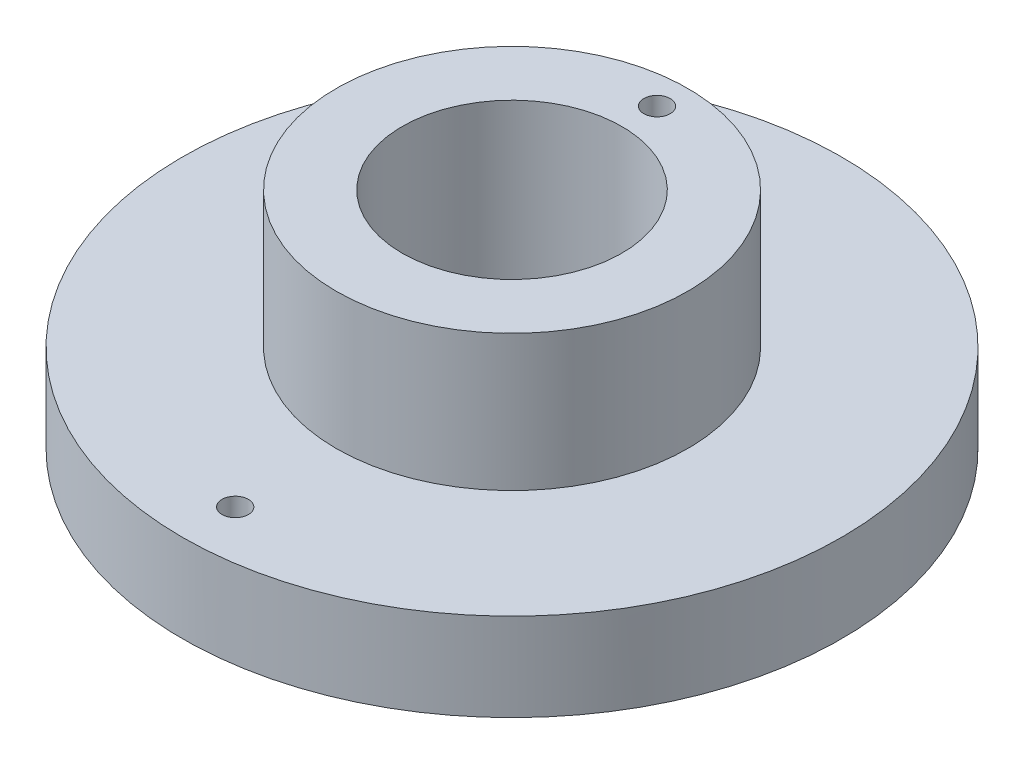
ISO-10303-21;
HEADER;
FILE_DESCRIPTION(('STEP AP214'),'2;1');
FILE_NAME('part.step','',(''),(''),'','','');
FILE_SCHEMA(('AUTOMOTIVE_DESIGN { 1 0 10303 214 1 1 1 1 }'));
ENDSEC;
DATA;
#1=APPLICATION_CONTEXT('core data for automotive mechanical design processes');
#2=APPLICATION_PROTOCOL_DEFINITION('international standard','automotive_design',2000,#1);
#3=PRODUCT_CONTEXT('',#1,'mechanical');
#4=PRODUCT('Part','Part','',(#3));
#5=PRODUCT_RELATED_PRODUCT_CATEGORY('part','',(#4));
#6=PRODUCT_DEFINITION_FORMATION('','',#4);
#7=PRODUCT_DEFINITION_CONTEXT('part definition',#1,'design');
#8=PRODUCT_DEFINITION('design','',#6,#7);
#9=PRODUCT_DEFINITION_SHAPE('','',#8);
#10=(LENGTH_UNIT() NAMED_UNIT(*) SI_UNIT(.MILLI.,.METRE.));
#11=(NAMED_UNIT(*) PLANE_ANGLE_UNIT() SI_UNIT($,.RADIAN.));
#12=(NAMED_UNIT(*) SI_UNIT($,.STERADIAN.) SOLID_ANGLE_UNIT());
#13=UNCERTAINTY_MEASURE_WITH_UNIT(LENGTH_MEASURE(1.E-05),#10,'distance_accuracy_value','');
#14=(GEOMETRIC_REPRESENTATION_CONTEXT(3) GLOBAL_UNCERTAINTY_ASSIGNED_CONTEXT((#13)) GLOBAL_UNIT_ASSIGNED_CONTEXT((#10,
#11,#12)) REPRESENTATION_CONTEXT('',''));
#15=CARTESIAN_POINT('',(0.,0.,0.));
#16=DIRECTION('',(0.,0.,1.));
#17=DIRECTION('',(1.,0.,0.));
#18=AXIS2_PLACEMENT_3D('',#15,#16,#17);
#19=CARTESIAN_POINT('',(0.,9.5,-28.5));
#20=DIRECTION('',(0.,-1.,0.));
#21=DIRECTION('',(0.,0.,-1.));
#22=AXIS2_PLACEMENT_3D('',#19,#20,#21);
#23=CYLINDRICAL_SURFACE('',#22,1.5);
#24=CARTESIAN_POINT('',(0.,4.,-28.5));
#25=DIRECTION('',(0.,-1.,0.));
#26=DIRECTION('',(0.,0.,-1.));
#27=AXIS2_PLACEMENT_3D('',#24,#25,#26);
#28=CIRCLE('',#27,1.5);
#29=CARTESIAN_POINT('',(0.,4.,-30.));
#30=VERTEX_POINT('',#29);
#31=EDGE_CURVE('E121',#30,#30,#28,.T.);
#32=ORIENTED_EDGE('',*,*,#31,.T.);
#33=EDGE_LOOP('',(#32));
#34=FACE_BOUND('',#33,.T.);
#35=CARTESIAN_POINT('',(0.,8.,-28.5));
#36=DIRECTION('',(0.,-0.707106781186547,-0.707106781186547));
#37=DIRECTION('',(0.,-0.707106781186547,0.707106781186547));
#38=AXIS2_PLACEMENT_3D('',#35,#36,#37);
#39=ELLIPSE('',#38,2.12132034355964,1.5);
#40=CARTESIAN_POINT('',(-1.5,8.,-28.5));
#41=VERTEX_POINT('',#40);
#42=CARTESIAN_POINT('',(1.5,8.,-28.5));
#43=VERTEX_POINT('',#42);
#44=EDGE_CURVE('E62',#41,#43,#39,.F.);
#45=ORIENTED_EDGE('',*,*,#44,.T.);
#46=CARTESIAN_POINT('',(0.,8.,-28.5));
#47=DIRECTION('',(0.,-0.707106781186547,0.707106781186547));
#48=DIRECTION('',(0.,-0.707106781186547,-0.707106781186547));
#49=AXIS2_PLACEMENT_3D('',#46,#47,#48);
#50=ELLIPSE('',#49,2.12132034355964,1.5);
#51=CARTESIAN_POINT('',(0.,6.5,-30.));
#52=VERTEX_POINT('',#51);
#53=EDGE_CURVE('E194',#43,#52,#50,.F.);
#54=ORIENTED_EDGE('',*,*,#53,.T.);
#55=EDGE_CURVE('E189',#52,#41,#50,.F.);
#56=ORIENTED_EDGE('',*,*,#55,.T.);
#57=EDGE_LOOP('',(#45,#54,#56));
#58=FACE_BOUND('',#57,.T.);
#59=ADVANCED_FACE('F41',(#34,#58),#23,.F.);
#60=CARTESIAN_POINT('',(0.,8.,0.));
#61=DIRECTION('',(0.,-1.,0.));
#62=DIRECTION('',(0.,0.,-1.));
#63=AXIS2_PLACEMENT_3D('',#60,#61,#62);
#64=CYLINDRICAL_SURFACE('',#63,20.);
#65=CARTESIAN_POINT('',(0.,0.,0.));
#66=DIRECTION('',(0.,1.,0.));
#67=DIRECTION('',(0.,0.,1.));
#68=AXIS2_PLACEMENT_3D('',#65,#66,#67);
#69=CIRCLE('',#68,20.);
#70=CARTESIAN_POINT('',(-20.,0.,0.));
#71=VERTEX_POINT('',#70);
#72=CARTESIAN_POINT('',(20.,0.,0.));
#73=VERTEX_POINT('',#72);
#74=EDGE_CURVE('E242',#71,#73,#69,.T.);
#75=ORIENTED_EDGE('',*,*,#74,.T.);
#76=DIRECTION('',(0.,-1.,0.));
#77=VECTOR('',#76,1.);
#78=CARTESIAN_POINT('',(20.,8.,0.));
#79=LINE('',#78,#77);
#80=CARTESIAN_POINT('',(20.,8.,0.));
#81=VERTEX_POINT('',#80);
#82=EDGE_CURVE('E229',#81,#73,#79,.T.);
#83=ORIENTED_EDGE('',*,*,#82,.F.);
#84=CARTESIAN_POINT('',(0.,8.,0.));
#85=DIRECTION('',(0.,1.,0.));
#86=DIRECTION('',(0.,0.,1.));
#87=AXIS2_PLACEMENT_3D('',#84,#85,#86);
#88=CIRCLE('',#87,20.);
#89=CARTESIAN_POINT('',(-20.,8.,0.));
#90=VERTEX_POINT('',#89);
#91=EDGE_CURVE('E246',#90,#81,#88,.T.);
#92=ORIENTED_EDGE('',*,*,#91,.F.);
#93=DIRECTION('',(0.,-1.,0.));
#94=VECTOR('',#93,1.);
#95=CARTESIAN_POINT('',(-20.,8.,0.));
#96=LINE('',#95,#94);
#97=EDGE_CURVE('E259',#90,#71,#96,.T.);
#98=ORIENTED_EDGE('',*,*,#97,.T.);
#99=EDGE_LOOP('',(#75,#83,#92,#98));
#100=FACE_BOUND('',#99,.T.);
#101=ADVANCED_FACE('F168',(#100),#64,.T.);
#102=CARTESIAN_POINT('',(20.,8.,0.));
#103=DIRECTION('',(-1.,0.,0.));
#104=DIRECTION('',(0.,0.,1.));
#105=AXIS2_PLACEMENT_3D('',#102,#103,#104);
#106=PLANE('',#105);
#107=DIRECTION('',(0.,0.,-1.));
#108=VECTOR('',#107,1.);
#109=CARTESIAN_POINT('',(20.,0.,0.));
#110=LINE('',#109,#108);
#111=CARTESIAN_POINT('',(20.,0.,-31.7214438511238));
#112=VERTEX_POINT('',#111);
#113=EDGE_CURVE('E263',#73,#112,#110,.T.);
#114=ORIENTED_EDGE('',*,*,#113,.T.);
#115=DIRECTION('',(0.,-1.,0.));
#116=VECTOR('',#115,1.);
#117=CARTESIAN_POINT('',(20.,8.,-31.7214438511238));
#118=LINE('',#117,#116);
#119=CARTESIAN_POINT('',(20.,8.,-31.7214438511238));
#120=VERTEX_POINT('',#119);
#121=EDGE_CURVE('E278',#120,#112,#118,.T.);
#122=ORIENTED_EDGE('',*,*,#121,.F.);
#123=DIRECTION('',(0.,0.,-1.));
#124=VECTOR('',#123,1.);
#125=CARTESIAN_POINT('',(20.,8.,0.));
#126=LINE('',#125,#124);
#127=EDGE_CURVE('E250',#81,#120,#126,.T.);
#128=ORIENTED_EDGE('',*,*,#127,.F.);
#129=ORIENTED_EDGE('',*,*,#82,.T.);
#130=EDGE_LOOP('',(#114,#122,#128,#129));
#131=FACE_BOUND('',#130,.T.);
#132=ADVANCED_FACE('F173',(#131),#106,.F.);
#133=CARTESIAN_POINT('',(0.,8.,0.));
#134=DIRECTION('',(0.,-1.,0.));
#135=DIRECTION('',(0.,0.,-1.));
#136=AXIS2_PLACEMENT_3D('',#133,#134,#135);
#137=CYLINDRICAL_SURFACE('',#136,37.5);
#138=CARTESIAN_POINT('',(0.,0.,0.));
#139=DIRECTION('',(0.,1.,0.));
#140=DIRECTION('',(0.,0.,1.));
#141=AXIS2_PLACEMENT_3D('',#138,#139,#140);
#142=CIRCLE('',#141,37.5);
#143=CARTESIAN_POINT('',(-20.,0.,-31.7214438511238));
#144=VERTEX_POINT('',#143);
#145=EDGE_CURVE('E266',#112,#144,#142,.T.);
#146=ORIENTED_EDGE('',*,*,#145,.T.);
#147=DIRECTION('',(0.,-1.,0.));
#148=VECTOR('',#147,1.);
#149=CARTESIAN_POINT('',(-20.,8.,-31.7214438511238));
#150=LINE('',#149,#148);
#151=CARTESIAN_POINT('',(-20.,8.,-31.7214438511238));
#152=VERTEX_POINT('',#151);
#153=EDGE_CURVE('E274',#152,#144,#150,.T.);
#154=ORIENTED_EDGE('',*,*,#153,.F.);
#155=CARTESIAN_POINT('',(0.,8.,0.));
#156=DIRECTION('',(0.,1.,0.));
#157=DIRECTION('',(0.,0.,1.));
#158=AXIS2_PLACEMENT_3D('',#155,#156,#157);
#159=CIRCLE('',#158,37.5);
#160=EDGE_CURVE('E234',#152,#120,#159,.T.);
#161=ORIENTED_EDGE('',*,*,#160,.T.);
#162=ORIENTED_EDGE('',*,*,#121,.T.);
#163=EDGE_LOOP('',(#146,#154,#161,#162));
#164=FACE_BOUND('',#163,.T.);
#165=CARTESIAN_POINT('',(0.,18.,0.));
#166=DIRECTION('',(0.,1.,0.));
#167=DIRECTION('',(0.,0.,1.));
#168=AXIS2_PLACEMENT_3D('',#165,#166,#167);
#169=CIRCLE('',#168,37.5);
#170=CARTESIAN_POINT('',(0.,18.,37.5));
#171=VERTEX_POINT('',#170);
#172=EDGE_CURVE('E238',#171,#171,#169,.T.);
#173=ORIENTED_EDGE('',*,*,#172,.F.);
#174=EDGE_LOOP('',(#173));
#175=FACE_BOUND('',#174,.T.);
#176=ADVANCED_FACE('F298',(#164,#175),#137,.T.);
#177=CARTESIAN_POINT('',(-20.,8.,0.));
#178=DIRECTION('',(1.,0.,0.));
#179=DIRECTION('',(0.,0.,-1.));
#180=AXIS2_PLACEMENT_3D('',#177,#178,#179);
#181=PLANE('',#180);
#182=DIRECTION('',(0.,0.,1.));
#183=VECTOR('',#182,1.);
#184=CARTESIAN_POINT('',(-20.,0.,0.));
#185=LINE('',#184,#183);
#186=EDGE_CURVE('E251',#144,#71,#185,.T.);
#187=ORIENTED_EDGE('',*,*,#186,.T.);
#188=ORIENTED_EDGE('',*,*,#97,.F.);
#189=DIRECTION('',(0.,0.,1.));
#190=VECTOR('',#189,1.);
#191=CARTESIAN_POINT('',(-20.,8.,0.));
#192=LINE('',#191,#190);
#193=EDGE_CURVE('E255',#152,#90,#192,.T.);
#194=ORIENTED_EDGE('',*,*,#193,.F.);
#195=ORIENTED_EDGE('',*,*,#153,.T.);
#196=EDGE_LOOP('',(#187,#188,#194,#195));
#197=FACE_BOUND('',#196,.T.);
#198=ADVANCED_FACE('F302',(#197),#181,.F.);
#199=CARTESIAN_POINT('',(0.,0.,0.));
#200=DIRECTION('',(0.,1.,0.));
#201=DIRECTION('',(0.,0.,1.));
#202=AXIS2_PLACEMENT_3D('',#199,#200,#201);
#203=PLANE('',#202);
#204=CARTESIAN_POINT('',(0.,0.,-28.5));
#205=DIRECTION('',(0.,-1.,0.));
#206=DIRECTION('',(0.,0.,-1.));
#207=AXIS2_PLACEMENT_3D('',#204,#205,#206);
#208=CIRCLE('',#207,7.5);
#209=CARTESIAN_POINT('',(0.,0.,-36.));
#210=VERTEX_POINT('',#209);
#211=EDGE_CURVE('E205',#210,#210,#208,.T.);
#212=ORIENTED_EDGE('',*,*,#211,.F.);
#213=EDGE_LOOP('',(#212));
#214=FACE_BOUND('',#213,.T.);
#215=CARTESIAN_POINT('',(0.,0.,0.));
#216=DIRECTION('',(0.,1.,0.));
#217=DIRECTION('',(0.,0.,1.));
#218=AXIS2_PLACEMENT_3D('',#215,#216,#217);
#219=CIRCLE('',#218,12.5);
#220=CARTESIAN_POINT('',(0.,0.,12.5));
#221=VERTEX_POINT('',#220);
#222=EDGE_CURVE('E214',#221,#221,#219,.T.);
#223=ORIENTED_EDGE('',*,*,#222,.T.);
#224=EDGE_LOOP('',(#223));
#225=FACE_BOUND('',#224,.T.);
#226=ORIENTED_EDGE('',*,*,#74,.F.);
#227=ORIENTED_EDGE('',*,*,#186,.F.);
#228=ORIENTED_EDGE('',*,*,#145,.F.);
#229=ORIENTED_EDGE('',*,*,#113,.F.);
#230=EDGE_LOOP('',(#226,#227,#228,#229));
#231=FACE_BOUND('',#230,.T.);
#232=ADVANCED_FACE('F295',(#214,#225,#231),#203,.F.);
#233=CARTESIAN_POINT('',(0.,8.,0.));
#234=DIRECTION('',(0.,1.,0.));
#235=DIRECTION('',(0.,0.,1.));
#236=AXIS2_PLACEMENT_3D('',#233,#234,#235);
#237=PLANE('',#236);
#238=CARTESIAN_POINT('',(0.,8.,31.5));
#239=DIRECTION('',(0.,1.,0.));
#240=DIRECTION('',(0.,0.,1.));
#241=AXIS2_PLACEMENT_3D('',#238,#239,#240);
#242=CIRCLE('',#241,1.5);
#243=CARTESIAN_POINT('',(0.,8.,33.));
#244=VERTEX_POINT('',#243);
#245=EDGE_CURVE('E224',#244,#244,#242,.T.);
#246=ORIENTED_EDGE('',*,*,#245,.T.);
#247=EDGE_LOOP('',(#246));
#248=FACE_BOUND('',#247,.T.);
#249=ORIENTED_EDGE('',*,*,#91,.T.);
#250=ORIENTED_EDGE('',*,*,#127,.T.);
#251=ORIENTED_EDGE('',*,*,#160,.F.);
#252=ORIENTED_EDGE('',*,*,#193,.T.);
#253=EDGE_LOOP('',(#249,#250,#251,#252));
#254=FACE_BOUND('',#253,.T.);
#255=ADVANCED_FACE('F305',(#248,#254),#237,.F.);
#256=CARTESIAN_POINT('',(0.,18.,0.));
#257=DIRECTION('',(0.,1.,0.));
#258=DIRECTION('',(0.,0.,1.));
#259=AXIS2_PLACEMENT_3D('',#256,#257,#258);
#260=PLANE('',#259);
#261=CARTESIAN_POINT('',(0.,18.,0.));
#262=DIRECTION('',(0.,1.,0.));
#263=DIRECTION('',(0.,0.,1.));
#264=AXIS2_PLACEMENT_3D('',#261,#262,#263);
#265=CIRCLE('',#264,20.);
#266=CARTESIAN_POINT('',(0.,18.,20.));
#267=VERTEX_POINT('',#266);
#268=EDGE_CURVE('E225',#267,#267,#265,.T.);
#269=ORIENTED_EDGE('',*,*,#268,.F.);
#270=EDGE_LOOP('',(#269));
#271=FACE_BOUND('',#270,.T.);
#272=ORIENTED_EDGE('',*,*,#172,.T.);
#273=EDGE_LOOP('',(#272));
#274=FACE_BOUND('',#273,.T.);
#275=CARTESIAN_POINT('',(0.,18.,31.5));
#276=DIRECTION('',(0.,1.,0.));
#277=DIRECTION('',(0.,0.,1.));
#278=AXIS2_PLACEMENT_3D('',#275,#276,#277);
#279=CIRCLE('',#278,1.5);
#280=CARTESIAN_POINT('',(0.,18.,33.));
#281=VERTEX_POINT('',#280);
#282=EDGE_CURVE('E230',#281,#281,#279,.T.);
#283=ORIENTED_EDGE('',*,*,#282,.F.);
#284=EDGE_LOOP('',(#283));
#285=FACE_BOUND('',#284,.T.);
#286=ADVANCED_FACE('F307',(#271,#274,#285),#260,.T.);
#287=CARTESIAN_POINT('',(0.,18.,31.5));
#288=DIRECTION('',(0.,-1.,0.));
#289=DIRECTION('',(0.,0.,-1.));
#290=AXIS2_PLACEMENT_3D('',#287,#288,#289);
#291=CYLINDRICAL_SURFACE('',#290,1.5);
#292=ORIENTED_EDGE('',*,*,#282,.T.);
#293=EDGE_LOOP('',(#292));
#294=FACE_BOUND('',#293,.T.);
#295=ORIENTED_EDGE('',*,*,#245,.F.);
#296=EDGE_LOOP('',(#295));
#297=FACE_BOUND('',#296,.T.);
#298=ADVANCED_FACE('F314',(#294,#297),#291,.F.);
#299=CARTESIAN_POINT('',(0.,33.5,0.));
#300=DIRECTION('',(0.,-1.,0.));
#301=DIRECTION('',(0.,0.,-1.));
#302=AXIS2_PLACEMENT_3D('',#299,#300,#301);
#303=CYLINDRICAL_SURFACE('',#302,20.);
#304=CARTESIAN_POINT('',(0.,33.5,0.));
#305=DIRECTION('',(0.,1.,0.));
#306=DIRECTION('',(0.,0.,1.));
#307=AXIS2_PLACEMENT_3D('',#304,#305,#306);
#308=CIRCLE('',#307,20.);
#309=CARTESIAN_POINT('',(0.,33.5,20.));
#310=VERTEX_POINT('',#309);
#311=EDGE_CURVE('E219',#310,#310,#308,.T.);
#312=ORIENTED_EDGE('',*,*,#311,.F.);
#313=EDGE_LOOP('',(#312));
#314=FACE_BOUND('',#313,.T.);
#315=ORIENTED_EDGE('',*,*,#268,.T.);
#316=EDGE_LOOP('',(#315));
#317=FACE_BOUND('',#316,.T.);
#318=ADVANCED_FACE('F348',(#314,#317),#303,.T.);
#319=CARTESIAN_POINT('',(0.,33.5,0.));
#320=DIRECTION('',(0.,1.,0.));
#321=DIRECTION('',(0.,0.,1.));
#322=AXIS2_PLACEMENT_3D('',#319,#320,#321);
#323=PLANE('',#322);
#324=CARTESIAN_POINT('',(0.,33.5,-16.5));
#325=DIRECTION('',(0.,1.,0.));
#326=DIRECTION('',(0.,0.,1.));
#327=AXIS2_PLACEMENT_3D('',#324,#325,#326);
#328=CIRCLE('',#327,1.5);
#329=CARTESIAN_POINT('',(0.,33.5,-15.));
#330=VERTEX_POINT('',#329);
#331=EDGE_CURVE('E433',#330,#330,#328,.T.);
#332=ORIENTED_EDGE('',*,*,#331,.F.);
#333=EDGE_LOOP('',(#332));
#334=FACE_BOUND('',#333,.T.);
#335=CARTESIAN_POINT('',(0.,33.5,0.));
#336=DIRECTION('',(0.,1.,0.));
#337=DIRECTION('',(0.,0.,1.));
#338=AXIS2_PLACEMENT_3D('',#335,#336,#337);
#339=CIRCLE('',#338,12.5);
#340=CARTESIAN_POINT('',(0.,33.5,12.5));
#341=VERTEX_POINT('',#340);
#342=EDGE_CURVE('E209',#341,#341,#339,.T.);
#343=ORIENTED_EDGE('',*,*,#342,.F.);
#344=EDGE_LOOP('',(#343));
#345=FACE_BOUND('',#344,.T.);
#346=ORIENTED_EDGE('',*,*,#311,.T.);
#347=EDGE_LOOP('',(#346));
#348=FACE_BOUND('',#347,.T.);
#349=ADVANCED_FACE('F164',(#334,#345,#348),#323,.T.);
#350=CARTESIAN_POINT('',(0.,0.,0.));
#351=DIRECTION('',(0.,1.,0.));
#352=DIRECTION('',(0.,0.,1.));
#353=AXIS2_PLACEMENT_3D('',#350,#351,#352);
#354=CYLINDRICAL_SURFACE('',#353,12.5);
#355=CARTESIAN_POINT('',(1.5,8.,-12.4096736459909));
#356=CARTESIAN_POINT('',(1.49999641586388,7.91607042940482,-12.4096748089167));
#357=CARTESIAN_POINT('',(1.49293206748169,7.8320877399393,-12.4105342894214));
#358=CARTESIAN_POINT('',(1.46486159354819,7.66645769398423,-12.4138782255216));
#359=CARTESIAN_POINT('',(1.44384072619508,7.58481290215949,-12.4163643992983));
#360=CARTESIAN_POINT('',(1.38848417307918,7.4262807972431,-12.4226761552619));
#361=CARTESIAN_POINT('',(1.35415731394874,7.3493903694319,-12.426500849368));
#362=CARTESIAN_POINT('',(1.27318168778971,7.20247642894952,-12.4350576249844));
#363=CARTESIAN_POINT('',(1.22653510106007,7.13245170421602,-12.4397895458966));
#364=CARTESIAN_POINT('',(1.1219857196502,7.00088011419492,-12.4496550027324));
#365=CARTESIAN_POINT('',(1.06403198625323,6.9393738528257,-12.4547902908254));
#366=CARTESIAN_POINT('',(0.938622932174395,6.82693564091905,-12.4648680792729));
#367=CARTESIAN_POINT('',(0.871167147527068,6.77600420702911,-12.4698105701984));
#368=CARTESIAN_POINT('',(0.728414784233988,6.68601673353187,-12.4789637011531));
#369=CARTESIAN_POINT('',(0.653094976924495,6.64699729213019,-12.4831720690333));
#370=CARTESIAN_POINT('',(0.496912883636389,6.58217576980764,-12.4903635621621));
#371=CARTESIAN_POINT('',(0.416050788042771,6.55637323512614,-12.4933467294733));
#372=CARTESIAN_POINT('',(0.251493928492541,6.51883887194828,-12.4977393662263));
#373=CARTESIAN_POINT('',(0.16781473552169,6.50703967327712,-12.4991563682204));
#374=CARTESIAN_POINT('',(-0.000347248334282176,6.49763820034475,-12.5002827183051));
#375=CARTESIAN_POINT('',(-0.0848300098341692,6.50003540892089,-12.4999921286017));
#376=CARTESIAN_POINT('',(-0.251742833758764,6.51890456092568,-12.4977421462633));
#377=CARTESIAN_POINT('',(-0.334181218784106,6.5353040524862,-12.4957913442169));
#378=CARTESIAN_POINT('',(-0.495127185045588,6.581599075858,-12.490449821119));
#379=CARTESIAN_POINT('',(-0.573634696521301,6.61149484709083,-12.4870590745233));
#380=CARTESIAN_POINT('',(-0.724715561629687,6.68401136445327,-12.4792038952277));
#381=CARTESIAN_POINT('',(-0.797273648637691,6.72666361800322,-12.4747368094346));
#382=CARTESIAN_POINT('',(-0.934229460099391,6.82345944947808,-12.465229048358));
#383=CARTESIAN_POINT('',(-0.998626839383445,6.87760351320781,-12.4601883488298));
#384=CARTESIAN_POINT('',(-1.11785860561525,6.99625217477023,-12.4500603372648));
#385=CARTESIAN_POINT('',(-1.17263019439189,7.06081989068675,-12.4449729316271));
#386=CARTESIAN_POINT('',(-1.27056795912578,7.19826575683976,-12.4353563023037));
#387=CARTESIAN_POINT('',(-1.31373410365263,7.27114392958224,-12.4308270801297));
#388=CARTESIAN_POINT('',(-1.38723839179325,7.42319624507369,-12.4228396027608));
#389=CARTESIAN_POINT('',(-1.41757175578821,7.50237272062896,-12.4193817467283));
#390=CARTESIAN_POINT('',(-1.46449505016189,7.66474617975059,-12.4139364153306));
#391=CARTESIAN_POINT('',(-1.48108558929275,7.74794298505965,-12.4119488748366));
#392=CARTESIAN_POINT('',(-1.49996964356083,7.91544154818834,-12.4096810007818));
#393=CARTESIAN_POINT('',(-1.50235142135386,7.99973321794057,-12.4093901280317));
#394=CARTESIAN_POINT('',(-1.49298299027801,8.16751439042147,-12.4105206650573));
#395=CARTESIAN_POINT('',(-1.48123305845624,8.25100390884369,-12.411942041265));
#396=CARTESIAN_POINT('',(-1.44400895971009,8.41454789179899,-12.4163273137489));
#397=CARTESIAN_POINT('',(-1.41857731249469,8.49461217340466,-12.4192864301079));
#398=CARTESIAN_POINT('',(-1.35475538396312,8.64933964148798,-12.4264098926624));
#399=CARTESIAN_POINT('',(-1.31636468129306,8.72400265225153,-12.4305742780457));
#400=CARTESIAN_POINT('',(-1.22749651360805,8.86620814748732,-12.4396643656649));
#401=CARTESIAN_POINT('',(-1.17696103570738,8.93371414344066,-12.4445936804928));
#402=CARTESIAN_POINT('',(-1.06532008918354,9.0593175565059,-12.4546467770184));
#403=CARTESIAN_POINT('',(-1.0042142422181,9.11741463670294,-12.4597705656719));
#404=CARTESIAN_POINT('',(-0.872782136333861,9.22285987361746,-12.4696675472455));
#405=CARTESIAN_POINT('',(-0.802409249708917,9.27015012325571,-12.4744387628015));
#406=CARTESIAN_POINT('',(-0.654668214705289,9.35223910466455,-12.483063621558));
#407=CARTESIAN_POINT('',(-0.577300197822208,9.38703807118723,-12.4869172820019));
#408=CARTESIAN_POINT('',(-0.417959622359993,9.4430605024379,-12.4932640215257));
#409=CARTESIAN_POINT('',(-0.335999085323591,9.46431775994213,-12.4957604851314));
#410=CARTESIAN_POINT('',(-0.169640292495739,9.49276337179108,-12.4991255682254));
#411=CARTESIAN_POINT('',(-0.085242137730631,9.49995230834657,-12.4999942550783));
#412=CARTESIAN_POINT('',(0.0830300031278291,9.50004692205617,-12.5000056524324));
#413=CARTESIAN_POINT('',(0.166903952329435,9.49304201834161,-12.4991591682624));
#414=CARTESIAN_POINT('',(0.332273612398116,9.46513677254877,-12.4958567701035));
#415=CARTESIAN_POINT('',(0.413769324044743,9.44423643502524,-12.4934008566421));
#416=CARTESIAN_POINT('',(0.572059777991806,9.38916099243421,-12.4871544009745));
#417=CARTESIAN_POINT('',(0.648855904373997,9.35498981777276,-12.4833642539575));
#418=CARTESIAN_POINT('',(0.795637705262654,9.2743519652078,-12.474869622158));
#419=CARTESIAN_POINT('',(0.865623324646849,9.22788518779857,-12.4701651299761));
#420=CARTESIAN_POINT('',(0.997254742124291,9.12364315899688,-12.4603319681132));
#421=CARTESIAN_POINT('',(1.0588476339384,9.06580132233712,-12.4552009088046));
#422=CARTESIAN_POINT('',(1.17148865356204,8.94058848142379,-12.4451123432295));
#423=CARTESIAN_POINT('',(1.22253427406543,8.87321521774935,-12.4401548784622));
#424=CARTESIAN_POINT('',(1.31278537364373,8.73057853191476,-12.4309559603764));
#425=CARTESIAN_POINT('',(1.35194799100155,8.65528783586353,-12.4267171228205));
#426=CARTESIAN_POINT('',(1.41701902911872,8.49919112312462,-12.419466118837));
#427=CARTESIAN_POINT('',(1.44294198213015,8.41839126440112,-12.4164526081981));
#428=CARTESIAN_POINT('',(1.4745350503682,8.28097023044731,-12.4127313618494));
#429=CARTESIAN_POINT('',(1.48407082470974,8.22521862402006,-12.4115903654975));
#430=CARTESIAN_POINT('',(1.49680448454755,8.11298603393288,-12.4100611186528));
#431=CARTESIAN_POINT('',(1.50000241299709,8.05650505521871,-12.4096728630583));
#432=CARTESIAN_POINT('',(1.5,8.,-12.4096736459909));
#433=B_SPLINE_CURVE_WITH_KNOTS('',3,(#355,#356,#357,#358,#359,#360,#361,#362,#363,#364,#365,
#366,#367,#368,#369,#370,#371,#372,#373,#374,#375,#376,#377,#378,#379,#380,#381,#382,#383,#384,
#385,#386,#387,#388,#389,#390,#391,#392,#393,#394,#395,#396,#397,#398,#399,#400,#401,#402,#403,
#404,#405,#406,#407,#408,#409,#410,#411,#412,#413,#414,#415,#416,#417,#418,#419,#420,#421,#422,
#423,#424,#425,#426,#427,#428,#429,#430,#431,#432),.UNSPECIFIED.,.T.,.F.,(4,2,2,2,2,2,2,2,2,2,2,
2,2,2,2,2,2,2,2,2,2,2,2,2,2,2,2,2,2,2,2,2,2,2,2,2,2,2,4),(0.,0.25158230660961,0.503430774819311,
0.755112462522262,1.0067496383611,1.25954776660377,1.51235824273611,1.7659378087677,
2.01950866836447,2.27185458608052,2.52419131111312,2.77523023079344,3.02627360403335,
3.27794222677635,3.52962149067918,3.78288622204422,4.03615163930559,4.28951130338294,
4.54285974404081,4.79463277043148,5.0464008609825,5.29739099483104,5.54838929022027,
5.80061125155309,6.05284224246468,6.30639464647639,6.55994228515919,6.81285470170487,
7.06575665136928,7.31707030939076,7.56838388503437,7.81962308616498,8.07086432058376,
8.32362252061905,8.57644073759112,8.83016031080822,9.08360079205962,9.25297814464872,
9.42235434931908),.UNSPECIFIED.);
#434=CARTESIAN_POINT('',(1.5,8.,-12.4096736459909));
#435=VERTEX_POINT('',#434);
#436=EDGE_CURVE('E118',#435,#435,#433,.T.);
#437=ORIENTED_EDGE('',*,*,#436,.T.);
#438=EDGE_LOOP('',(#437));
#439=FACE_BOUND('',#438,.T.);
#440=ORIENTED_EDGE('',*,*,#222,.F.);
#441=EDGE_LOOP('',(#440));
#442=FACE_BOUND('',#441,.T.);
#443=ORIENTED_EDGE('',*,*,#342,.T.);
#444=EDGE_LOOP('',(#443));
#445=FACE_BOUND('',#444,.T.);
#446=ADVANCED_FACE('F140',(#439,#442,#445),#354,.F.);
#447=CARTESIAN_POINT('',(0.,4.,-28.5));
#448=DIRECTION('',(0.,-1.,0.));
#449=DIRECTION('',(0.,0.,-1.));
#450=AXIS2_PLACEMENT_3D('',#447,#448,#449);
#451=PLANE('',#450);
#452=ORIENTED_EDGE('',*,*,#31,.F.);
#453=EDGE_LOOP('',(#452));
#454=FACE_BOUND('',#453,.T.);
#455=CARTESIAN_POINT('',(0.,4.,-28.5));
#456=DIRECTION('',(0.,-1.,0.));
#457=DIRECTION('',(0.,0.,-1.));
#458=AXIS2_PLACEMENT_3D('',#455,#456,#457);
#459=CIRCLE('',#458,3.5);
#460=CARTESIAN_POINT('',(0.,4.,-32.));
#461=VERTEX_POINT('',#460);
#462=EDGE_CURVE('E104',#461,#461,#459,.T.);
#463=ORIENTED_EDGE('',*,*,#462,.T.);
#464=EDGE_LOOP('',(#463));
#465=FACE_BOUND('',#464,.T.);
#466=ADVANCED_FACE('F156',(#454,#465),#451,.T.);
#467=CARTESIAN_POINT('',(0.,0.,-28.5));
#468=DIRECTION('',(0.,-1.,0.));
#469=DIRECTION('',(0.,0.,-1.));
#470=AXIS2_PLACEMENT_3D('',#467,#468,#469);
#471=DEGENERATE_TOROIDAL_SURFACE('',#470,3.5,4.,.T.);
#472=ORIENTED_EDGE('',*,*,#211,.T.);
#473=EDGE_LOOP('',(#472));
#474=FACE_BOUND('',#473,.T.);
#475=ORIENTED_EDGE('',*,*,#462,.F.);
#476=EDGE_LOOP('',(#475));
#477=FACE_BOUND('',#476,.T.);
#478=ADVANCED_FACE('F43',(#474,#477),#471,.F.);
#479=CARTESIAN_POINT('',(0.,8.,-30.));
#480=DIRECTION('',(0.,0.,1.));
#481=DIRECTION('',(1.,0.,0.));
#482=AXIS2_PLACEMENT_3D('',#479,#480,#481);
#483=CYLINDRICAL_SURFACE('',#482,1.5);
#484=CARTESIAN_POINT('',(0.,8.,-16.5));
#485=DIRECTION('',(0.,-0.707106781186547,0.707106781186547));
#486=DIRECTION('',(0.,0.707106781186547,0.707106781186547));
#487=AXIS2_PLACEMENT_3D('',#484,#485,#486);
#488=ELLIPSE('',#487,2.12132034355964,1.5);
#489=CARTESIAN_POINT('',(-1.5,8.,-16.5));
#490=VERTEX_POINT('',#489);
#491=CARTESIAN_POINT('',(1.5,8.,-16.5));
#492=VERTEX_POINT('',#491);
#493=EDGE_CURVE('E50',#490,#492,#488,.F.);
#494=ORIENTED_EDGE('',*,*,#493,.T.);
#495=CARTESIAN_POINT('',(0.,8.,-16.5));
#496=DIRECTION('',(0.,0.707106781186547,0.707106781186547));
#497=DIRECTION('',(0.,-0.707106781186547,0.707106781186547));
#498=AXIS2_PLACEMENT_3D('',#495,#496,#497);
#499=ELLIPSE('',#498,2.12132034355964,1.5);
#500=EDGE_CURVE('E11',#492,#490,#499,.T.);
#501=ORIENTED_EDGE('',*,*,#500,.T.);
#502=EDGE_LOOP('',(#494,#501));
#503=FACE_BOUND('',#502,.T.);
#504=CARTESIAN_POINT('',(0.,8.,-28.5));
#505=DIRECTION('',(0.,-0.707106781186547,0.707106781186547));
#506=DIRECTION('',(0.,-0.707106781186547,-0.707106781186547));
#507=AXIS2_PLACEMENT_3D('',#504,#505,#506);
#508=ELLIPSE('',#507,2.12132034355964,1.5);
#509=CARTESIAN_POINT('',(0.,9.5,-27.));
#510=VERTEX_POINT('',#509);
#511=EDGE_CURVE('E114',#510,#41,#508,.T.);
#512=ORIENTED_EDGE('',*,*,#511,.F.);
#513=EDGE_CURVE('E185',#43,#510,#508,.T.);
#514=ORIENTED_EDGE('',*,*,#513,.F.);
#515=ORIENTED_EDGE('',*,*,#44,.F.);
#516=EDGE_LOOP('',(#512,#514,#515));
#517=FACE_BOUND('',#516,.T.);
#518=ORIENTED_EDGE('',*,*,#436,.F.);
#519=EDGE_LOOP('',(#518));
#520=FACE_BOUND('',#519,.T.);
#521=ADVANCED_FACE('F105',(#503,#517,#520),#483,.F.);
#522=CARTESIAN_POINT('',(0.,9.5,-28.5));
#523=DIRECTION('',(0.,-1.,0.));
#524=DIRECTION('',(0.,0.,-1.));
#525=AXIS2_PLACEMENT_3D('',#522,#523,#524);
#526=PLANE('',#525);
#527=CARTESIAN_POINT('',(0.,9.5,-28.5));
#528=DIRECTION('',(0.,-1.,0.));
#529=DIRECTION('',(0.,0.,-1.));
#530=AXIS2_PLACEMENT_3D('',#527,#528,#529);
#531=CIRCLE('',#530,1.5);
#532=CARTESIAN_POINT('',(0.,9.5,-30.));
#533=VERTEX_POINT('',#532);
#534=EDGE_CURVE('E139',#533,#510,#531,.T.);
#535=ORIENTED_EDGE('',*,*,#534,.T.);
#536=EDGE_CURVE('E127',#510,#533,#531,.T.);
#537=ORIENTED_EDGE('',*,*,#536,.T.);
#538=EDGE_LOOP('',(#535,#537));
#539=FACE_BOUND('',#538,.T.);
#540=ADVANCED_FACE('F108',(#539),#526,.T.);
#541=CARTESIAN_POINT('',(0.,8.,-28.5));
#542=DIRECTION('',(0.,-0.707106781186547,-0.707106781186547));
#543=DIRECTION('',(0.,-0.707106781186547,0.707106781186547));
#544=AXIS2_PLACEMENT_3D('',#541,#542,#543);
#545=ELLIPSE('',#544,2.12132034355964,1.5);
#546=EDGE_CURVE('E131',#533,#43,#545,.T.);
#547=ORIENTED_EDGE('',*,*,#546,.T.);
#548=ORIENTED_EDGE('',*,*,#513,.T.);
#549=ORIENTED_EDGE('',*,*,#534,.F.);
#550=EDGE_LOOP('',(#547,#548,#549));
#551=FACE_BOUND('',#550,.T.);
#552=ADVANCED_FACE('F151',(#551),#23,.F.);
#553=ORIENTED_EDGE('',*,*,#511,.T.);
#554=EDGE_CURVE('E122',#41,#533,#545,.T.);
#555=ORIENTED_EDGE('',*,*,#554,.T.);
#556=ORIENTED_EDGE('',*,*,#536,.F.);
#557=EDGE_LOOP('',(#553,#555,#556));
#558=FACE_BOUND('',#557,.T.);
#559=ADVANCED_FACE('F154',(#558),#23,.F.);
#560=ORIENTED_EDGE('',*,*,#55,.F.);
#561=CARTESIAN_POINT('',(0.,8.,-30.));
#562=DIRECTION('',(0.,0.,1.));
#563=DIRECTION('',(1.,0.,0.));
#564=AXIS2_PLACEMENT_3D('',#561,#562,#563);
#565=CIRCLE('',#564,1.5);
#566=EDGE_CURVE('E191',#533,#52,#565,.T.);
#567=ORIENTED_EDGE('',*,*,#566,.F.);
#568=ORIENTED_EDGE('',*,*,#554,.F.);
#569=EDGE_LOOP('',(#560,#567,#568));
#570=FACE_BOUND('',#569,.T.);
#571=ADVANCED_FACE('F110',(#570),#483,.F.);
#572=ORIENTED_EDGE('',*,*,#546,.F.);
#573=EDGE_CURVE('E201',#52,#533,#565,.T.);
#574=ORIENTED_EDGE('',*,*,#573,.F.);
#575=ORIENTED_EDGE('',*,*,#53,.F.);
#576=EDGE_LOOP('',(#572,#574,#575));
#577=FACE_BOUND('',#576,.T.);
#578=ADVANCED_FACE('F111',(#577),#483,.F.);
#579=CARTESIAN_POINT('',(0.,8.,-30.));
#580=DIRECTION('',(0.,0.,1.));
#581=DIRECTION('',(1.,0.,0.));
#582=AXIS2_PLACEMENT_3D('',#579,#580,#581);
#583=PLANE('',#582);
#584=ORIENTED_EDGE('',*,*,#566,.T.);
#585=ORIENTED_EDGE('',*,*,#573,.T.);
#586=EDGE_LOOP('',(#584,#585));
#587=FACE_BOUND('',#586,.T.);
#588=ADVANCED_FACE('F147',(#587),#583,.T.);
#589=CARTESIAN_POINT('',(0.,8.,-16.5));
#590=DIRECTION('',(0.,1.,0.));
#591=DIRECTION('',(0.,0.,1.));
#592=AXIS2_PLACEMENT_3D('',#589,#590,#591);
#593=CYLINDRICAL_SURFACE('',#592,1.5);
#594=ORIENTED_EDGE('',*,*,#331,.T.);
#595=EDGE_LOOP('',(#594));
#596=FACE_BOUND('',#595,.T.);
#597=ORIENTED_EDGE('',*,*,#493,.F.);
#598=ORIENTED_EDGE('',*,*,#500,.F.);
#599=EDGE_LOOP('',(#597,#598));
#600=FACE_BOUND('',#599,.T.);
#601=ADVANCED_FACE('F101',(#596,#600),#593,.F.);
#602=CLOSED_SHELL('',(#59,#101,#132,#176,#198,#232,#255,#286,#298,#318,#349,#446,#466,#478,#521,
#540,#552,#559,#571,#578,#588,#601));
#603=MANIFOLD_SOLID_BREP('B2',#602);
#604=ADVANCED_BREP_SHAPE_REPRESENTATION('',(#18,#603),#14);
#605=SHAPE_DEFINITION_REPRESENTATION(#9,#604);
ENDSEC;
END-ISO-10303-21;
